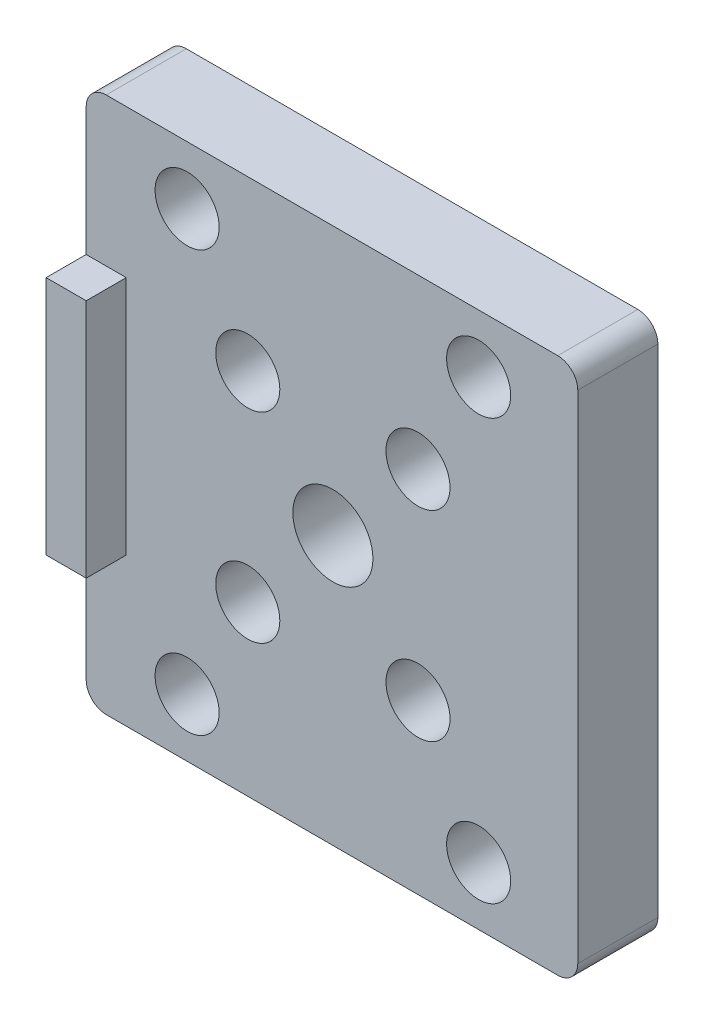
ISO-10303-21;
HEADER;
FILE_DESCRIPTION(('STEP AP214'),'2;1');
FILE_NAME('part.step','',(''),(''),'','','');
FILE_SCHEMA(('AUTOMOTIVE_DESIGN { 1 0 10303 214 1 1 1 1 }'));
ENDSEC;
DATA;
#1=APPLICATION_CONTEXT('core data for automotive mechanical design processes');
#2=APPLICATION_PROTOCOL_DEFINITION('international standard','automotive_design',2000,#1);
#3=PRODUCT_CONTEXT('',#1,'mechanical');
#4=PRODUCT('Part','Part','',(#3));
#5=PRODUCT_RELATED_PRODUCT_CATEGORY('part','',(#4));
#6=PRODUCT_DEFINITION_FORMATION('','',#4);
#7=PRODUCT_DEFINITION_CONTEXT('part definition',#1,'design');
#8=PRODUCT_DEFINITION('design','',#6,#7);
#9=PRODUCT_DEFINITION_SHAPE('','',#8);
#10=(LENGTH_UNIT() NAMED_UNIT(*) SI_UNIT(.MILLI.,.METRE.));
#11=(NAMED_UNIT(*) PLANE_ANGLE_UNIT() SI_UNIT($,.RADIAN.));
#12=(NAMED_UNIT(*) SI_UNIT($,.STERADIAN.) SOLID_ANGLE_UNIT());
#13=UNCERTAINTY_MEASURE_WITH_UNIT(LENGTH_MEASURE(1.E-05),#10,'distance_accuracy_value','');
#14=(GEOMETRIC_REPRESENTATION_CONTEXT(3) GLOBAL_UNCERTAINTY_ASSIGNED_CONTEXT((#13)) GLOBAL_UNIT_ASSIGNED_CONTEXT((#10,
#11,#12)) REPRESENTATION_CONTEXT('',''));
#15=CARTESIAN_POINT('',(0.,0.,0.));
#16=DIRECTION('',(0.,0.,1.));
#17=DIRECTION('',(1.,0.,0.));
#18=AXIS2_PLACEMENT_3D('',#15,#16,#17);
#19=CARTESIAN_POINT('',(0.,0.,4.));
#20=DIRECTION('',(0.,0.,-1.));
#21=DIRECTION('',(-1.,0.,0.));
#22=AXIS2_PLACEMENT_3D('',#19,#20,#21);
#23=PLANE('',#22);
#24=CARTESIAN_POINT('',(-4.205,-5.,4.));
#25=DIRECTION('',(0.,0.,1.));
#26=DIRECTION('',(1.,0.,0.));
#27=AXIS2_PLACEMENT_3D('',#24,#25,#26);
#28=CIRCLE('',#27,1.59999999999999);
#29=CARTESIAN_POINT('',(-2.60500000000002,-5.,4.));
#30=VERTEX_POINT('',#29);
#31=EDGE_CURVE('E204',#30,#30,#28,.T.);
#32=ORIENTED_EDGE('',*,*,#31,.F.);
#33=EDGE_LOOP('',(#32));
#34=FACE_BOUND('',#33,.T.);
#35=CARTESIAN_POINT('',(4.295,-5.,4.));
#36=DIRECTION('',(0.,0.,1.));
#37=DIRECTION('',(1.,0.,0.));
#38=AXIS2_PLACEMENT_3D('',#35,#36,#37);
#39=CIRCLE('',#38,1.59999999999999);
#40=CARTESIAN_POINT('',(5.89499999999998,-5.,4.));
#41=VERTEX_POINT('',#40);
#42=EDGE_CURVE('E198',#41,#41,#39,.T.);
#43=ORIENTED_EDGE('',*,*,#42,.F.);
#44=EDGE_LOOP('',(#43));
#45=FACE_BOUND('',#44,.T.);
#46=CARTESIAN_POINT('',(4.295,5.,4.));
#47=DIRECTION('',(0.,0.,1.));
#48=DIRECTION('',(1.,0.,0.));
#49=AXIS2_PLACEMENT_3D('',#46,#47,#48);
#50=CIRCLE('',#49,1.59999999999999);
#51=CARTESIAN_POINT('',(5.89499999999998,5.,4.));
#52=VERTEX_POINT('',#51);
#53=EDGE_CURVE('E192',#52,#52,#50,.T.);
#54=ORIENTED_EDGE('',*,*,#53,.F.);
#55=EDGE_LOOP('',(#54));
#56=FACE_BOUND('',#55,.T.);
#57=CARTESIAN_POINT('',(-4.205,5.,4.));
#58=DIRECTION('',(0.,0.,1.));
#59=DIRECTION('',(1.,0.,0.));
#60=AXIS2_PLACEMENT_3D('',#57,#58,#59);
#61=CIRCLE('',#60,1.59999999999999);
#62=CARTESIAN_POINT('',(-2.60500000000002,5.,4.));
#63=VERTEX_POINT('',#62);
#64=EDGE_CURVE('E186',#63,#63,#61,.T.);
#65=ORIENTED_EDGE('',*,*,#64,.F.);
#66=EDGE_LOOP('',(#65));
#67=FACE_BOUND('',#66,.T.);
#68=CARTESIAN_POINT('',(7.325,-10.5,4.));
#69=DIRECTION('',(0.,0.,1.));
#70=DIRECTION('',(1.,0.,0.));
#71=AXIS2_PLACEMENT_3D('',#68,#69,#70);
#72=CIRCLE('',#71,1.59999999999999);
#73=CARTESIAN_POINT('',(8.92499999999998,-10.5,4.));
#74=VERTEX_POINT('',#73);
#75=EDGE_CURVE('E180',#74,#74,#72,.T.);
#76=ORIENTED_EDGE('',*,*,#75,.F.);
#77=EDGE_LOOP('',(#76));
#78=FACE_BOUND('',#77,.T.);
#79=CARTESIAN_POINT('',(-7.235,-10.5,4.));
#80=DIRECTION('',(0.,0.,1.));
#81=DIRECTION('',(1.,0.,0.));
#82=AXIS2_PLACEMENT_3D('',#79,#80,#81);
#83=CIRCLE('',#82,1.59999999999999);
#84=CARTESIAN_POINT('',(-5.63500000000001,-10.5,4.));
#85=VERTEX_POINT('',#84);
#86=EDGE_CURVE('E174',#85,#85,#83,.T.);
#87=ORIENTED_EDGE('',*,*,#86,.F.);
#88=EDGE_LOOP('',(#87));
#89=FACE_BOUND('',#88,.T.);
#90=CARTESIAN_POINT('',(7.325,10.5,4.));
#91=DIRECTION('',(0.,0.,1.));
#92=DIRECTION('',(1.,0.,0.));
#93=AXIS2_PLACEMENT_3D('',#90,#91,#92);
#94=CIRCLE('',#93,1.59999999999999);
#95=CARTESIAN_POINT('',(8.92499999999998,10.5,4.));
#96=VERTEX_POINT('',#95);
#97=EDGE_CURVE('E168',#96,#96,#94,.T.);
#98=ORIENTED_EDGE('',*,*,#97,.F.);
#99=EDGE_LOOP('',(#98));
#100=FACE_BOUND('',#99,.T.);
#101=CARTESIAN_POINT('',(-7.235,10.5,4.));
#102=DIRECTION('',(0.,0.,1.));
#103=DIRECTION('',(1.,0.,0.));
#104=AXIS2_PLACEMENT_3D('',#101,#102,#103);
#105=CIRCLE('',#104,1.59999999999999);
#106=CARTESIAN_POINT('',(-5.63500000000001,10.5,4.));
#107=VERTEX_POINT('',#106);
#108=EDGE_CURVE('E162',#107,#107,#105,.T.);
#109=ORIENTED_EDGE('',*,*,#108,.F.);
#110=EDGE_LOOP('',(#109));
#111=FACE_BOUND('',#110,.T.);
#112=CARTESIAN_POINT('',(0.0449999999999982,0.,4.));
#113=DIRECTION('',(0.,0.,1.));
#114=DIRECTION('',(1.,0.,0.));
#115=AXIS2_PLACEMENT_3D('',#112,#113,#114);
#116=CIRCLE('',#115,2.);
#117=CARTESIAN_POINT('',(2.045,0.,4.));
#118=VERTEX_POINT('',#117);
#119=EDGE_CURVE('E153',#118,#118,#116,.T.);
#120=ORIENTED_EDGE('',*,*,#119,.F.);
#121=EDGE_LOOP('',(#120));
#122=FACE_BOUND('',#121,.T.);
#123=DIRECTION('',(0.,-1.,0.));
#124=VECTOR('',#123,1.);
#125=CARTESIAN_POINT('',(-12.275,-13.4,4.));
#126=LINE('',#125,#124);
#127=CARTESIAN_POINT('',(-12.275,-6.,4.));
#128=VERTEX_POINT('',#127);
#129=CARTESIAN_POINT('',(-12.275,-12.4,4.));
#130=VERTEX_POINT('',#129);
#131=EDGE_CURVE('E152',#128,#130,#126,.T.);
#132=ORIENTED_EDGE('',*,*,#131,.T.);
#133=CARTESIAN_POINT('',(-11.275,-12.4,4.));
#134=DIRECTION('',(0.,0.,-1.));
#135=DIRECTION('',(-1.,0.,0.));
#136=AXIS2_PLACEMENT_3D('',#133,#134,#135);
#137=CIRCLE('',#136,1.);
#138=CARTESIAN_POINT('',(-11.275,-13.4,4.));
#139=VERTEX_POINT('',#138);
#140=EDGE_CURVE('E254',#130,#139,#137,.F.);
#141=ORIENTED_EDGE('',*,*,#140,.T.);
#142=DIRECTION('',(1.,0.,0.));
#143=VECTOR('',#142,1.);
#144=CARTESIAN_POINT('',(-12.275,-13.4,4.));
#145=LINE('',#144,#143);
#146=CARTESIAN_POINT('',(11.275,-13.4,4.));
#147=VERTEX_POINT('',#146);
#148=EDGE_CURVE('E218',#139,#147,#145,.T.);
#149=ORIENTED_EDGE('',*,*,#148,.T.);
#150=CARTESIAN_POINT('',(11.275,-12.4,4.));
#151=DIRECTION('',(0.,0.,-1.));
#152=DIRECTION('',(-1.,0.,0.));
#153=AXIS2_PLACEMENT_3D('',#150,#151,#152);
#154=CIRCLE('',#153,1.);
#155=CARTESIAN_POINT('',(12.275,-12.4,4.));
#156=VERTEX_POINT('',#155);
#157=EDGE_CURVE('E252',#147,#156,#154,.F.);
#158=ORIENTED_EDGE('',*,*,#157,.T.);
#159=DIRECTION('',(0.,1.,0.));
#160=VECTOR('',#159,1.);
#161=CARTESIAN_POINT('',(12.275,-13.4,4.));
#162=LINE('',#161,#160);
#163=CARTESIAN_POINT('',(12.275,12.4,4.));
#164=VERTEX_POINT('',#163);
#165=EDGE_CURVE('E211',#156,#164,#162,.T.);
#166=ORIENTED_EDGE('',*,*,#165,.T.);
#167=CARTESIAN_POINT('',(11.275,12.4,4.));
#168=DIRECTION('',(0.,0.,-1.));
#169=DIRECTION('',(-1.,0.,0.));
#170=AXIS2_PLACEMENT_3D('',#167,#168,#169);
#171=CIRCLE('',#170,1.);
#172=CARTESIAN_POINT('',(11.275,13.4,4.));
#173=VERTEX_POINT('',#172);
#174=EDGE_CURVE('E57',#164,#173,#171,.F.);
#175=ORIENTED_EDGE('',*,*,#174,.T.);
#176=DIRECTION('',(-1.,0.,0.));
#177=VECTOR('',#176,1.);
#178=CARTESIAN_POINT('',(-12.275,13.4,4.));
#179=LINE('',#178,#177);
#180=CARTESIAN_POINT('',(-11.275,13.4,4.));
#181=VERTEX_POINT('',#180);
#182=EDGE_CURVE('E213',#173,#181,#179,.T.);
#183=ORIENTED_EDGE('',*,*,#182,.T.);
#184=CARTESIAN_POINT('',(-11.275,12.4,4.));
#185=DIRECTION('',(0.,0.,-1.));
#186=DIRECTION('',(-1.,0.,0.));
#187=AXIS2_PLACEMENT_3D('',#184,#185,#186);
#188=CIRCLE('',#187,1.);
#189=CARTESIAN_POINT('',(-12.275,12.4,4.));
#190=VERTEX_POINT('',#189);
#191=EDGE_CURVE('E250',#181,#190,#188,.F.);
#192=ORIENTED_EDGE('',*,*,#191,.T.);
#193=CARTESIAN_POINT('',(-12.275,6.,4.));
#194=VERTEX_POINT('',#193);
#195=EDGE_CURVE('E216',#190,#194,#126,.T.);
#196=ORIENTED_EDGE('',*,*,#195,.T.);
#197=DIRECTION('',(-1.,0.,0.));
#198=VECTOR('',#197,1.);
#199=CARTESIAN_POINT('',(-12.275,6.,4.));
#200=LINE('',#199,#198);
#201=CARTESIAN_POINT('',(-10.275,6.,4.));
#202=VERTEX_POINT('',#201);
#203=EDGE_CURVE('E146',#202,#194,#200,.T.);
#204=ORIENTED_EDGE('',*,*,#203,.F.);
#205=DIRECTION('',(0.,1.,0.));
#206=VECTOR('',#205,1.);
#207=CARTESIAN_POINT('',(-10.275,-6.,4.));
#208=LINE('',#207,#206);
#209=CARTESIAN_POINT('',(-10.275,-6.,4.));
#210=VERTEX_POINT('',#209);
#211=EDGE_CURVE('E283',#210,#202,#208,.T.);
#212=ORIENTED_EDGE('',*,*,#211,.F.);
#213=DIRECTION('',(1.,0.,0.));
#214=VECTOR('',#213,1.);
#215=CARTESIAN_POINT('',(-12.275,-6.,4.));
#216=LINE('',#215,#214);
#217=EDGE_CURVE('E285',#128,#210,#216,.T.);
#218=ORIENTED_EDGE('',*,*,#217,.F.);
#219=EDGE_LOOP('',(#132,#141,#149,#158,#166,#175,#183,#192,#196,#204,#212,#218));
#220=FACE_BOUND('',#219,.T.);
#221=ADVANCED_FACE('F37',(#34,#45,#56,#67,#78,#89,#100,#111,#122,#220),#23,.F.);
#222=CARTESIAN_POINT('',(12.275,-13.4,4.));
#223=DIRECTION('',(-1.,0.,0.));
#224=DIRECTION('',(0.,0.,1.));
#225=AXIS2_PLACEMENT_3D('',#222,#223,#224);
#226=PLANE('',#225);
#227=ORIENTED_EDGE('',*,*,#165,.F.);
#228=DIRECTION('',(0.,0.,-1.));
#229=VECTOR('',#228,1.);
#230=CARTESIAN_POINT('',(12.275,-12.4,4.));
#231=LINE('',#230,#229);
#232=CARTESIAN_POINT('',(12.275,-12.4,0.));
#233=VERTEX_POINT('',#232);
#234=EDGE_CURVE('E258',#156,#233,#231,.T.);
#235=ORIENTED_EDGE('',*,*,#234,.T.);
#236=DIRECTION('',(0.,1.,0.));
#237=VECTOR('',#236,1.);
#238=CARTESIAN_POINT('',(12.275,-13.4,0.));
#239=LINE('',#238,#237);
#240=CARTESIAN_POINT('',(12.275,12.4,0.));
#241=VERTEX_POINT('',#240);
#242=EDGE_CURVE('E210',#233,#241,#239,.T.);
#243=ORIENTED_EDGE('',*,*,#242,.T.);
#244=DIRECTION('',(0.,0.,-1.));
#245=VECTOR('',#244,1.);
#246=CARTESIAN_POINT('',(12.275,12.4,4.));
#247=LINE('',#246,#245);
#248=EDGE_CURVE('E256',#241,#164,#247,.F.);
#249=ORIENTED_EDGE('',*,*,#248,.T.);
#250=EDGE_LOOP('',(#227,#235,#243,#249));
#251=FACE_BOUND('',#250,.T.);
#252=ADVANCED_FACE('F303',(#251),#226,.F.);
#253=CARTESIAN_POINT('',(-12.275,13.4,4.));
#254=DIRECTION('',(0.,-1.,0.));
#255=DIRECTION('',(0.,0.,-1.));
#256=AXIS2_PLACEMENT_3D('',#253,#254,#255);
#257=PLANE('',#256);
#258=DIRECTION('',(-1.,0.,0.));
#259=VECTOR('',#258,1.);
#260=CARTESIAN_POINT('',(-12.275,13.4,0.));
#261=LINE('',#260,#259);
#262=CARTESIAN_POINT('',(11.275,13.4,0.));
#263=VERTEX_POINT('',#262);
#264=CARTESIAN_POINT('',(-11.275,13.4,0.));
#265=VERTEX_POINT('',#264);
#266=EDGE_CURVE('E224',#263,#265,#261,.T.);
#267=ORIENTED_EDGE('',*,*,#266,.T.);
#268=DIRECTION('',(0.,0.,-1.));
#269=VECTOR('',#268,1.);
#270=CARTESIAN_POINT('',(-11.275,13.4,4.));
#271=LINE('',#270,#269);
#272=EDGE_CURVE('E11',#265,#181,#271,.F.);
#273=ORIENTED_EDGE('',*,*,#272,.T.);
#274=ORIENTED_EDGE('',*,*,#182,.F.);
#275=DIRECTION('',(0.,0.,-1.));
#276=VECTOR('',#275,1.);
#277=CARTESIAN_POINT('',(11.275,13.4,4.));
#278=LINE('',#277,#276);
#279=EDGE_CURVE('E45',#173,#263,#278,.T.);
#280=ORIENTED_EDGE('',*,*,#279,.T.);
#281=EDGE_LOOP('',(#267,#273,#274,#280));
#282=FACE_BOUND('',#281,.T.);
#283=ADVANCED_FACE('F263',(#282),#257,.F.);
#284=CARTESIAN_POINT('',(-12.275,-13.4,4.));
#285=DIRECTION('',(1.,0.,0.));
#286=DIRECTION('',(0.,0.,-1.));
#287=AXIS2_PLACEMENT_3D('',#284,#285,#286);
#288=PLANE('',#287);
#289=DIRECTION('',(0.,-1.,0.));
#290=VECTOR('',#289,1.);
#291=CARTESIAN_POINT('',(-12.275,-13.4,0.));
#292=LINE('',#291,#290);
#293=CARTESIAN_POINT('',(-12.275,12.4,0.));
#294=VERTEX_POINT('',#293);
#295=CARTESIAN_POINT('',(-12.275,-12.4,0.));
#296=VERTEX_POINT('',#295);
#297=EDGE_CURVE('E226',#294,#296,#292,.T.);
#298=ORIENTED_EDGE('',*,*,#297,.T.);
#299=DIRECTION('',(0.,0.,-1.));
#300=VECTOR('',#299,1.);
#301=CARTESIAN_POINT('',(-12.275,-12.4,4.));
#302=LINE('',#301,#300);
#303=EDGE_CURVE('E247',#296,#130,#302,.F.);
#304=ORIENTED_EDGE('',*,*,#303,.T.);
#305=ORIENTED_EDGE('',*,*,#131,.F.);
#306=DIRECTION('',(0.,0.,-1.));
#307=VECTOR('',#306,1.);
#308=CARTESIAN_POINT('',(-12.275,-6.,6.));
#309=LINE('',#308,#307);
#310=CARTESIAN_POINT('',(-12.275,-6.,6.));
#311=VERTEX_POINT('',#310);
#312=EDGE_CURVE('E131',#311,#128,#309,.T.);
#313=ORIENTED_EDGE('',*,*,#312,.F.);
#314=DIRECTION('',(0.,-1.,0.));
#315=VECTOR('',#314,1.);
#316=CARTESIAN_POINT('',(-12.275,-6.,6.));
#317=LINE('',#316,#315);
#318=CARTESIAN_POINT('',(-12.275,6.,6.));
#319=VERTEX_POINT('',#318);
#320=EDGE_CURVE('E137',#319,#311,#317,.T.);
#321=ORIENTED_EDGE('',*,*,#320,.F.);
#322=DIRECTION('',(0.,0.,-1.));
#323=VECTOR('',#322,1.);
#324=CARTESIAN_POINT('',(-12.275,6.,6.));
#325=LINE('',#324,#323);
#326=EDGE_CURVE('E276',#319,#194,#325,.T.);
#327=ORIENTED_EDGE('',*,*,#326,.T.);
#328=ORIENTED_EDGE('',*,*,#195,.F.);
#329=DIRECTION('',(0.,0.,-1.));
#330=VECTOR('',#329,1.);
#331=CARTESIAN_POINT('',(-12.275,12.4,4.));
#332=LINE('',#331,#330);
#333=EDGE_CURVE('E244',#190,#294,#332,.T.);
#334=ORIENTED_EDGE('',*,*,#333,.T.);
#335=EDGE_LOOP('',(#298,#304,#305,#313,#321,#327,#328,#334));
#336=FACE_BOUND('',#335,.T.);
#337=ADVANCED_FACE('F150',(#336),#288,.F.);
#338=CARTESIAN_POINT('',(-12.275,-13.4,4.));
#339=DIRECTION('',(0.,1.,0.));
#340=DIRECTION('',(0.,0.,1.));
#341=AXIS2_PLACEMENT_3D('',#338,#339,#340);
#342=PLANE('',#341);
#343=ORIENTED_EDGE('',*,*,#148,.F.);
#344=DIRECTION('',(0.,0.,-1.));
#345=VECTOR('',#344,1.);
#346=CARTESIAN_POINT('',(-11.275,-13.4,4.));
#347=LINE('',#346,#345);
#348=CARTESIAN_POINT('',(-11.275,-13.4,0.));
#349=VERTEX_POINT('',#348);
#350=EDGE_CURVE('E233',#139,#349,#347,.T.);
#351=ORIENTED_EDGE('',*,*,#350,.T.);
#352=DIRECTION('',(1.,0.,0.));
#353=VECTOR('',#352,1.);
#354=CARTESIAN_POINT('',(-12.275,-13.4,0.));
#355=LINE('',#354,#353);
#356=CARTESIAN_POINT('',(11.275,-13.4,0.));
#357=VERTEX_POINT('',#356);
#358=EDGE_CURVE('E214',#349,#357,#355,.T.);
#359=ORIENTED_EDGE('',*,*,#358,.T.);
#360=DIRECTION('',(0.,0.,-1.));
#361=VECTOR('',#360,1.);
#362=CARTESIAN_POINT('',(11.275,-13.4,4.));
#363=LINE('',#362,#361);
#364=EDGE_CURVE('E221',#357,#147,#363,.F.);
#365=ORIENTED_EDGE('',*,*,#364,.T.);
#366=EDGE_LOOP('',(#343,#351,#359,#365));
#367=FACE_BOUND('',#366,.T.);
#368=ADVANCED_FACE('F320',(#367),#342,.F.);
#369=CARTESIAN_POINT('',(0.,0.,0.));
#370=DIRECTION('',(0.,0.,-1.));
#371=DIRECTION('',(-1.,0.,0.));
#372=AXIS2_PLACEMENT_3D('',#369,#370,#371);
#373=PLANE('',#372);
#374=CARTESIAN_POINT('',(0.0449999999999982,0.,0.));
#375=DIRECTION('',(0.,0.,-1.));
#376=DIRECTION('',(-1.,0.,0.));
#377=AXIS2_PLACEMENT_3D('',#374,#375,#376);
#378=CIRCLE('',#377,2.);
#379=CARTESIAN_POINT('',(-1.955,0.,0.));
#380=VERTEX_POINT('',#379);
#381=EDGE_CURVE('E156',#380,#380,#378,.T.);
#382=ORIENTED_EDGE('',*,*,#381,.F.);
#383=EDGE_LOOP('',(#382));
#384=FACE_BOUND('',#383,.T.);
#385=CARTESIAN_POINT('',(-7.235,10.5,0.));
#386=DIRECTION('',(0.,0.,1.));
#387=DIRECTION('',(1.,0.,0.));
#388=AXIS2_PLACEMENT_3D('',#385,#386,#387);
#389=CIRCLE('',#388,1.59999999999999);
#390=CARTESIAN_POINT('',(-5.63500000000001,10.5,0.));
#391=VERTEX_POINT('',#390);
#392=EDGE_CURVE('E165',#391,#391,#389,.T.);
#393=ORIENTED_EDGE('',*,*,#392,.T.);
#394=EDGE_LOOP('',(#393));
#395=FACE_BOUND('',#394,.T.);
#396=CARTESIAN_POINT('',(7.325,10.5,0.));
#397=DIRECTION('',(0.,0.,1.));
#398=DIRECTION('',(1.,0.,0.));
#399=AXIS2_PLACEMENT_3D('',#396,#397,#398);
#400=CIRCLE('',#399,1.59999999999999);
#401=CARTESIAN_POINT('',(8.92499999999999,10.5,0.));
#402=VERTEX_POINT('',#401);
#403=EDGE_CURVE('E171',#402,#402,#400,.T.);
#404=ORIENTED_EDGE('',*,*,#403,.T.);
#405=EDGE_LOOP('',(#404));
#406=FACE_BOUND('',#405,.T.);
#407=CARTESIAN_POINT('',(-7.235,-10.5,0.));
#408=DIRECTION('',(0.,0.,1.));
#409=DIRECTION('',(1.,0.,0.));
#410=AXIS2_PLACEMENT_3D('',#407,#408,#409);
#411=CIRCLE('',#410,1.59999999999999);
#412=CARTESIAN_POINT('',(-5.63500000000001,-10.5,0.));
#413=VERTEX_POINT('',#412);
#414=EDGE_CURVE('E177',#413,#413,#411,.T.);
#415=ORIENTED_EDGE('',*,*,#414,.T.);
#416=EDGE_LOOP('',(#415));
#417=FACE_BOUND('',#416,.T.);
#418=CARTESIAN_POINT('',(7.325,-10.5,0.));
#419=DIRECTION('',(0.,0.,1.));
#420=DIRECTION('',(1.,0.,0.));
#421=AXIS2_PLACEMENT_3D('',#418,#419,#420);
#422=CIRCLE('',#421,1.59999999999999);
#423=CARTESIAN_POINT('',(8.92499999999999,-10.5,0.));
#424=VERTEX_POINT('',#423);
#425=EDGE_CURVE('E183',#424,#424,#422,.T.);
#426=ORIENTED_EDGE('',*,*,#425,.T.);
#427=EDGE_LOOP('',(#426));
#428=FACE_BOUND('',#427,.T.);
#429=CARTESIAN_POINT('',(-4.205,5.,0.));
#430=DIRECTION('',(0.,0.,1.));
#431=DIRECTION('',(1.,0.,0.));
#432=AXIS2_PLACEMENT_3D('',#429,#430,#431);
#433=CIRCLE('',#432,1.59999999999999);
#434=CARTESIAN_POINT('',(-2.60500000000001,5.,0.));
#435=VERTEX_POINT('',#434);
#436=EDGE_CURVE('E189',#435,#435,#433,.T.);
#437=ORIENTED_EDGE('',*,*,#436,.T.);
#438=EDGE_LOOP('',(#437));
#439=FACE_BOUND('',#438,.T.);
#440=CARTESIAN_POINT('',(4.295,5.,0.));
#441=DIRECTION('',(0.,0.,1.));
#442=DIRECTION('',(1.,0.,0.));
#443=AXIS2_PLACEMENT_3D('',#440,#441,#442);
#444=CIRCLE('',#443,1.59999999999999);
#445=CARTESIAN_POINT('',(5.89499999999999,5.,0.));
#446=VERTEX_POINT('',#445);
#447=EDGE_CURVE('E195',#446,#446,#444,.T.);
#448=ORIENTED_EDGE('',*,*,#447,.T.);
#449=EDGE_LOOP('',(#448));
#450=FACE_BOUND('',#449,.T.);
#451=CARTESIAN_POINT('',(4.295,-5.,0.));
#452=DIRECTION('',(0.,0.,1.));
#453=DIRECTION('',(1.,0.,0.));
#454=AXIS2_PLACEMENT_3D('',#451,#452,#453);
#455=CIRCLE('',#454,1.59999999999999);
#456=CARTESIAN_POINT('',(5.89499999999999,-5.,0.));
#457=VERTEX_POINT('',#456);
#458=EDGE_CURVE('E201',#457,#457,#455,.T.);
#459=ORIENTED_EDGE('',*,*,#458,.T.);
#460=EDGE_LOOP('',(#459));
#461=FACE_BOUND('',#460,.T.);
#462=CARTESIAN_POINT('',(-4.205,-5.,0.));
#463=DIRECTION('',(0.,0.,1.));
#464=DIRECTION('',(1.,0.,0.));
#465=AXIS2_PLACEMENT_3D('',#462,#463,#464);
#466=CIRCLE('',#465,1.59999999999999);
#467=CARTESIAN_POINT('',(-2.60500000000001,-5.,0.));
#468=VERTEX_POINT('',#467);
#469=EDGE_CURVE('E207',#468,#468,#466,.T.);
#470=ORIENTED_EDGE('',*,*,#469,.T.);
#471=EDGE_LOOP('',(#470));
#472=FACE_BOUND('',#471,.T.);
#473=ORIENTED_EDGE('',*,*,#358,.F.);
#474=CARTESIAN_POINT('',(-11.275,-12.4,0.));
#475=DIRECTION('',(0.,0.,-1.));
#476=DIRECTION('',(-1.,0.,0.));
#477=AXIS2_PLACEMENT_3D('',#474,#475,#476);
#478=CIRCLE('',#477,1.);
#479=EDGE_CURVE('E242',#349,#296,#478,.T.);
#480=ORIENTED_EDGE('',*,*,#479,.T.);
#481=ORIENTED_EDGE('',*,*,#297,.F.);
#482=CARTESIAN_POINT('',(-11.275,12.4,0.));
#483=DIRECTION('',(0.,0.,-1.));
#484=DIRECTION('',(-1.,0.,0.));
#485=AXIS2_PLACEMENT_3D('',#482,#483,#484);
#486=CIRCLE('',#485,1.);
#487=EDGE_CURVE('E238',#294,#265,#486,.T.);
#488=ORIENTED_EDGE('',*,*,#487,.T.);
#489=ORIENTED_EDGE('',*,*,#266,.F.);
#490=CARTESIAN_POINT('',(11.275,12.4,0.));
#491=DIRECTION('',(0.,0.,-1.));
#492=DIRECTION('',(-1.,0.,0.));
#493=AXIS2_PLACEMENT_3D('',#490,#491,#492);
#494=CIRCLE('',#493,1.);
#495=EDGE_CURVE('E236',#263,#241,#494,.T.);
#496=ORIENTED_EDGE('',*,*,#495,.T.);
#497=ORIENTED_EDGE('',*,*,#242,.F.);
#498=CARTESIAN_POINT('',(11.275,-12.4,0.));
#499=DIRECTION('',(0.,0.,-1.));
#500=DIRECTION('',(-1.,0.,0.));
#501=AXIS2_PLACEMENT_3D('',#498,#499,#500);
#502=CIRCLE('',#501,1.);
#503=EDGE_CURVE('E240',#233,#357,#502,.T.);
#504=ORIENTED_EDGE('',*,*,#503,.T.);
#505=EDGE_LOOP('',(#473,#480,#481,#488,#489,#496,#497,#504));
#506=FACE_BOUND('',#505,.T.);
#507=ADVANCED_FACE('F267',(#384,#395,#406,#417,#428,#439,#450,#461,#472,#506),#373,.T.);
#508=CARTESIAN_POINT('',(-4.205,-5.,4.));
#509=DIRECTION('',(0.,0.,1.));
#510=DIRECTION('',(1.,0.,0.));
#511=AXIS2_PLACEMENT_3D('',#508,#509,#510);
#512=CYLINDRICAL_SURFACE('',#511,1.59999999999999);
#513=ORIENTED_EDGE('',*,*,#469,.F.);
#514=EDGE_LOOP('',(#513));
#515=FACE_BOUND('',#514,.T.);
#516=ORIENTED_EDGE('',*,*,#31,.T.);
#517=EDGE_LOOP('',(#516));
#518=FACE_BOUND('',#517,.T.);
#519=ADVANCED_FACE('F316',(#515,#518),#512,.F.);
#520=CARTESIAN_POINT('',(4.295,-5.,4.));
#521=DIRECTION('',(0.,0.,1.));
#522=DIRECTION('',(1.,0.,0.));
#523=AXIS2_PLACEMENT_3D('',#520,#521,#522);
#524=CYLINDRICAL_SURFACE('',#523,1.59999999999999);
#525=ORIENTED_EDGE('',*,*,#458,.F.);
#526=EDGE_LOOP('',(#525));
#527=FACE_BOUND('',#526,.T.);
#528=ORIENTED_EDGE('',*,*,#42,.T.);
#529=EDGE_LOOP('',(#528));
#530=FACE_BOUND('',#529,.T.);
#531=ADVANCED_FACE('F413',(#527,#530),#524,.F.);
#532=CARTESIAN_POINT('',(4.295,5.,4.));
#533=DIRECTION('',(0.,0.,1.));
#534=DIRECTION('',(1.,0.,0.));
#535=AXIS2_PLACEMENT_3D('',#532,#533,#534);
#536=CYLINDRICAL_SURFACE('',#535,1.59999999999999);
#537=ORIENTED_EDGE('',*,*,#447,.F.);
#538=EDGE_LOOP('',(#537));
#539=FACE_BOUND('',#538,.T.);
#540=ORIENTED_EDGE('',*,*,#53,.T.);
#541=EDGE_LOOP('',(#540));
#542=FACE_BOUND('',#541,.T.);
#543=ADVANCED_FACE('F421',(#539,#542),#536,.F.);
#544=CARTESIAN_POINT('',(-4.205,5.,4.));
#545=DIRECTION('',(0.,0.,1.));
#546=DIRECTION('',(1.,0.,0.));
#547=AXIS2_PLACEMENT_3D('',#544,#545,#546);
#548=CYLINDRICAL_SURFACE('',#547,1.59999999999999);
#549=ORIENTED_EDGE('',*,*,#436,.F.);
#550=EDGE_LOOP('',(#549));
#551=FACE_BOUND('',#550,.T.);
#552=ORIENTED_EDGE('',*,*,#64,.T.);
#553=EDGE_LOOP('',(#552));
#554=FACE_BOUND('',#553,.T.);
#555=ADVANCED_FACE('F429',(#551,#554),#548,.F.);
#556=CARTESIAN_POINT('',(7.325,-10.5,4.));
#557=DIRECTION('',(0.,0.,1.));
#558=DIRECTION('',(1.,0.,0.));
#559=AXIS2_PLACEMENT_3D('',#556,#557,#558);
#560=CYLINDRICAL_SURFACE('',#559,1.59999999999999);
#561=ORIENTED_EDGE('',*,*,#425,.F.);
#562=EDGE_LOOP('',(#561));
#563=FACE_BOUND('',#562,.T.);
#564=ORIENTED_EDGE('',*,*,#75,.T.);
#565=EDGE_LOOP('',(#564));
#566=FACE_BOUND('',#565,.T.);
#567=ADVANCED_FACE('F438',(#563,#566),#560,.F.);
#568=CARTESIAN_POINT('',(-7.235,-10.5,4.));
#569=DIRECTION('',(0.,0.,1.));
#570=DIRECTION('',(1.,0.,0.));
#571=AXIS2_PLACEMENT_3D('',#568,#569,#570);
#572=CYLINDRICAL_SURFACE('',#571,1.59999999999999);
#573=ORIENTED_EDGE('',*,*,#414,.F.);
#574=EDGE_LOOP('',(#573));
#575=FACE_BOUND('',#574,.T.);
#576=ORIENTED_EDGE('',*,*,#86,.T.);
#577=EDGE_LOOP('',(#576));
#578=FACE_BOUND('',#577,.T.);
#579=ADVANCED_FACE('F447',(#575,#578),#572,.F.);
#580=CARTESIAN_POINT('',(7.325,10.5,4.));
#581=DIRECTION('',(0.,0.,1.));
#582=DIRECTION('',(1.,0.,0.));
#583=AXIS2_PLACEMENT_3D('',#580,#581,#582);
#584=CYLINDRICAL_SURFACE('',#583,1.59999999999999);
#585=ORIENTED_EDGE('',*,*,#403,.F.);
#586=EDGE_LOOP('',(#585));
#587=FACE_BOUND('',#586,.T.);
#588=ORIENTED_EDGE('',*,*,#97,.T.);
#589=EDGE_LOOP('',(#588));
#590=FACE_BOUND('',#589,.T.);
#591=ADVANCED_FACE('F456',(#587,#590),#584,.F.);
#592=CARTESIAN_POINT('',(-7.235,10.5,4.));
#593=DIRECTION('',(0.,0.,1.));
#594=DIRECTION('',(1.,0.,0.));
#595=AXIS2_PLACEMENT_3D('',#592,#593,#594);
#596=CYLINDRICAL_SURFACE('',#595,1.59999999999999);
#597=ORIENTED_EDGE('',*,*,#392,.F.);
#598=EDGE_LOOP('',(#597));
#599=FACE_BOUND('',#598,.T.);
#600=ORIENTED_EDGE('',*,*,#108,.T.);
#601=EDGE_LOOP('',(#600));
#602=FACE_BOUND('',#601,.T.);
#603=ADVANCED_FACE('F465',(#599,#602),#596,.F.);
#604=CARTESIAN_POINT('',(0.0449999999999982,0.,-6.));
#605=DIRECTION('',(0.,0.,1.));
#606=DIRECTION('',(1.,0.,0.));
#607=AXIS2_PLACEMENT_3D('',#604,#605,#606);
#608=CYLINDRICAL_SURFACE('',#607,2.);
#609=ORIENTED_EDGE('',*,*,#381,.T.);
#610=EDGE_LOOP('',(#609));
#611=FACE_BOUND('',#610,.T.);
#612=ORIENTED_EDGE('',*,*,#119,.T.);
#613=EDGE_LOOP('',(#612));
#614=FACE_BOUND('',#613,.T.);
#615=ADVANCED_FACE('F300',(#611,#614),#608,.F.);
#616=CARTESIAN_POINT('',(-12.275,-6.,6.));
#617=DIRECTION('',(0.,1.,0.));
#618=DIRECTION('',(0.,0.,1.));
#619=AXIS2_PLACEMENT_3D('',#616,#617,#618);
#620=PLANE('',#619);
#621=ORIENTED_EDGE('',*,*,#217,.T.);
#622=DIRECTION('',(0.,0.,-1.));
#623=VECTOR('',#622,1.);
#624=CARTESIAN_POINT('',(-10.275,-6.,6.));
#625=LINE('',#624,#623);
#626=CARTESIAN_POINT('',(-10.275,-6.,6.));
#627=VERTEX_POINT('',#626);
#628=EDGE_CURVE('E133',#627,#210,#625,.T.);
#629=ORIENTED_EDGE('',*,*,#628,.F.);
#630=DIRECTION('',(1.,0.,0.));
#631=VECTOR('',#630,1.);
#632=CARTESIAN_POINT('',(-12.275,-6.,6.));
#633=LINE('',#632,#631);
#634=EDGE_CURVE('E126',#311,#627,#633,.T.);
#635=ORIENTED_EDGE('',*,*,#634,.F.);
#636=ORIENTED_EDGE('',*,*,#312,.T.);
#637=EDGE_LOOP('',(#621,#629,#635,#636));
#638=FACE_BOUND('',#637,.T.);
#639=ADVANCED_FACE('F129',(#638),#620,.F.);
#640=CARTESIAN_POINT('',(-10.275,-6.,6.));
#641=DIRECTION('',(-1.,0.,0.));
#642=DIRECTION('',(0.,0.,1.));
#643=AXIS2_PLACEMENT_3D('',#640,#641,#642);
#644=PLANE('',#643);
#645=ORIENTED_EDGE('',*,*,#211,.T.);
#646=DIRECTION('',(0.,0.,-1.));
#647=VECTOR('',#646,1.);
#648=CARTESIAN_POINT('',(-10.275,6.,6.));
#649=LINE('',#648,#647);
#650=CARTESIAN_POINT('',(-10.275,6.,6.));
#651=VERTEX_POINT('',#650);
#652=EDGE_CURVE('E158',#651,#202,#649,.T.);
#653=ORIENTED_EDGE('',*,*,#652,.F.);
#654=DIRECTION('',(0.,1.,0.));
#655=VECTOR('',#654,1.);
#656=CARTESIAN_POINT('',(-10.275,-6.,6.));
#657=LINE('',#656,#655);
#658=EDGE_CURVE('E136',#627,#651,#657,.T.);
#659=ORIENTED_EDGE('',*,*,#658,.F.);
#660=ORIENTED_EDGE('',*,*,#628,.T.);
#661=EDGE_LOOP('',(#645,#653,#659,#660));
#662=FACE_BOUND('',#661,.T.);
#663=ADVANCED_FACE('F292',(#662),#644,.F.);
#664=CARTESIAN_POINT('',(-12.275,6.,6.));
#665=DIRECTION('',(0.,-1.,0.));
#666=DIRECTION('',(1.,0.,0.));
#667=AXIS2_PLACEMENT_3D('',#664,#665,#666);
#668=PLANE('',#667);
#669=ORIENTED_EDGE('',*,*,#203,.T.);
#670=ORIENTED_EDGE('',*,*,#326,.F.);
#671=DIRECTION('',(-1.,0.,0.));
#672=VECTOR('',#671,1.);
#673=CARTESIAN_POINT('',(-12.275,6.,6.));
#674=LINE('',#673,#672);
#675=EDGE_CURVE('E142',#651,#319,#674,.T.);
#676=ORIENTED_EDGE('',*,*,#675,.F.);
#677=ORIENTED_EDGE('',*,*,#652,.T.);
#678=EDGE_LOOP('',(#669,#670,#676,#677));
#679=FACE_BOUND('',#678,.T.);
#680=ADVANCED_FACE('F281',(#679),#668,.F.);
#681=CARTESIAN_POINT('',(0.,0.,6.));
#682=DIRECTION('',(0.,0.,-1.));
#683=DIRECTION('',(-1.,0.,0.));
#684=AXIS2_PLACEMENT_3D('',#681,#682,#683);
#685=PLANE('',#684);
#686=ORIENTED_EDGE('',*,*,#320,.T.);
#687=ORIENTED_EDGE('',*,*,#634,.T.);
#688=ORIENTED_EDGE('',*,*,#658,.T.);
#689=ORIENTED_EDGE('',*,*,#675,.T.);
#690=EDGE_LOOP('',(#686,#687,#688,#689));
#691=FACE_BOUND('',#690,.T.);
#692=ADVANCED_FACE('F140',(#691),#685,.F.);
#693=CARTESIAN_POINT('',(-11.275,-12.4,4.));
#694=DIRECTION('',(0.,0.,-1.));
#695=DIRECTION('',(-1.,0.,0.));
#696=AXIS2_PLACEMENT_3D('',#693,#694,#695);
#697=CYLINDRICAL_SURFACE('',#696,1.);
#698=ORIENTED_EDGE('',*,*,#140,.F.);
#699=ORIENTED_EDGE('',*,*,#303,.F.);
#700=ORIENTED_EDGE('',*,*,#479,.F.);
#701=ORIENTED_EDGE('',*,*,#350,.F.);
#702=EDGE_LOOP('',(#698,#699,#700,#701));
#703=FACE_BOUND('',#702,.T.);
#704=ADVANCED_FACE('F329',(#703),#697,.T.);
#705=CARTESIAN_POINT('',(11.275,-12.4,4.));
#706=DIRECTION('',(0.,0.,-1.));
#707=DIRECTION('',(-1.,0.,0.));
#708=AXIS2_PLACEMENT_3D('',#705,#706,#707);
#709=CYLINDRICAL_SURFACE('',#708,1.);
#710=ORIENTED_EDGE('',*,*,#157,.F.);
#711=ORIENTED_EDGE('',*,*,#364,.F.);
#712=ORIENTED_EDGE('',*,*,#503,.F.);
#713=ORIENTED_EDGE('',*,*,#234,.F.);
#714=EDGE_LOOP('',(#710,#711,#712,#713));
#715=FACE_BOUND('',#714,.T.);
#716=ADVANCED_FACE('F332',(#715),#709,.T.);
#717=CARTESIAN_POINT('',(-11.275,12.4,4.));
#718=DIRECTION('',(0.,0.,-1.));
#719=DIRECTION('',(-1.,0.,0.));
#720=AXIS2_PLACEMENT_3D('',#717,#718,#719);
#721=CYLINDRICAL_SURFACE('',#720,1.);
#722=ORIENTED_EDGE('',*,*,#191,.F.);
#723=ORIENTED_EDGE('',*,*,#272,.F.);
#724=ORIENTED_EDGE('',*,*,#487,.F.);
#725=ORIENTED_EDGE('',*,*,#333,.F.);
#726=EDGE_LOOP('',(#722,#723,#724,#725));
#727=FACE_BOUND('',#726,.T.);
#728=ADVANCED_FACE('F273',(#727),#721,.T.);
#729=CARTESIAN_POINT('',(11.275,12.4,4.));
#730=DIRECTION('',(0.,0.,-1.));
#731=DIRECTION('',(-1.,0.,0.));
#732=AXIS2_PLACEMENT_3D('',#729,#730,#731);
#733=CYLINDRICAL_SURFACE('',#732,1.);
#734=ORIENTED_EDGE('',*,*,#174,.F.);
#735=ORIENTED_EDGE('',*,*,#248,.F.);
#736=ORIENTED_EDGE('',*,*,#495,.F.);
#737=ORIENTED_EDGE('',*,*,#279,.F.);
#738=EDGE_LOOP('',(#734,#735,#736,#737));
#739=FACE_BOUND('',#738,.T.);
#740=ADVANCED_FACE('F39',(#739),#733,.T.);
#741=CLOSED_SHELL('',(#221,#252,#283,#337,#368,#507,#519,#531,#543,#555,#567,#579,#591,#603,
#615,#639,#663,#680,#692,#704,#716,#728,#740));
#742=MANIFOLD_SOLID_BREP('B2',#741);
#743=ADVANCED_BREP_SHAPE_REPRESENTATION('',(#18,#742),#14);
#744=SHAPE_DEFINITION_REPRESENTATION(#9,#743);
ENDSEC;
END-ISO-10303-21;
